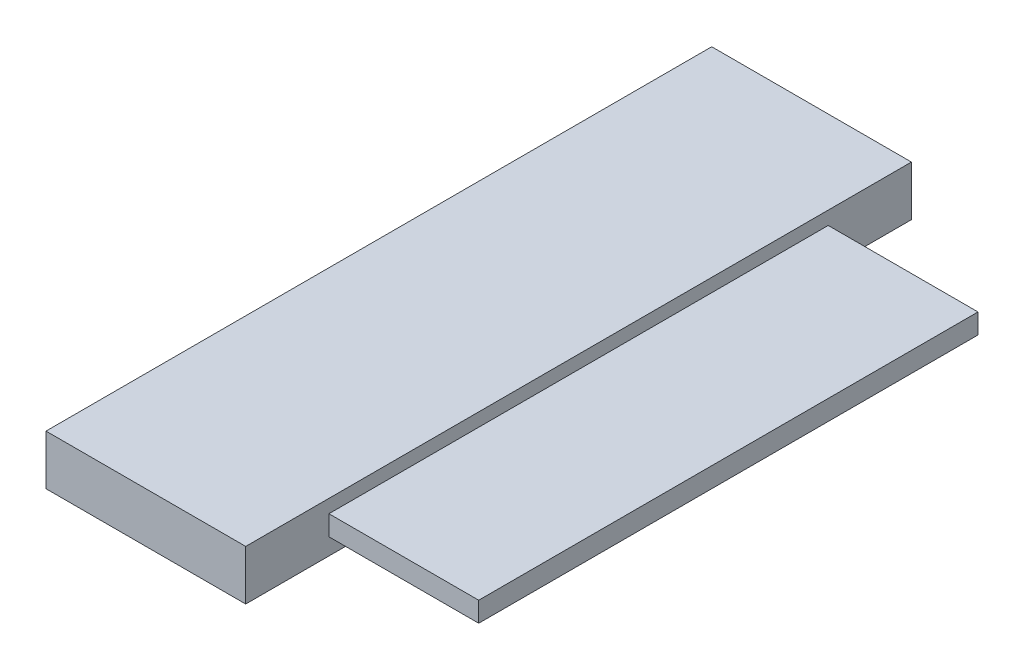
ISO-10303-21;
HEADER;
FILE_DESCRIPTION(('STEP AP214'),'2;1');
FILE_NAME('part.step','',(''),(''),'','','');
FILE_SCHEMA(('AUTOMOTIVE_DESIGN { 1 0 10303 214 1 1 1 1 }'));
ENDSEC;
DATA;
#1=APPLICATION_CONTEXT('core data for automotive mechanical design processes');
#2=APPLICATION_PROTOCOL_DEFINITION('international standard','automotive_design',2000,#1);
#3=PRODUCT_CONTEXT('',#1,'mechanical');
#4=PRODUCT('Part','Part','',(#3));
#5=PRODUCT_RELATED_PRODUCT_CATEGORY('part','',(#4));
#6=PRODUCT_DEFINITION_FORMATION('','',#4);
#7=PRODUCT_DEFINITION_CONTEXT('part definition',#1,'design');
#8=PRODUCT_DEFINITION('design','',#6,#7);
#9=PRODUCT_DEFINITION_SHAPE('','',#8);
#10=(LENGTH_UNIT() NAMED_UNIT(*) SI_UNIT(.MILLI.,.METRE.));
#11=(NAMED_UNIT(*) PLANE_ANGLE_UNIT() SI_UNIT($,.RADIAN.));
#12=(NAMED_UNIT(*) SI_UNIT($,.STERADIAN.) SOLID_ANGLE_UNIT());
#13=UNCERTAINTY_MEASURE_WITH_UNIT(LENGTH_MEASURE(1.E-05),#10,'distance_accuracy_value','');
#14=(GEOMETRIC_REPRESENTATION_CONTEXT(3) GLOBAL_UNCERTAINTY_ASSIGNED_CONTEXT((#13)) GLOBAL_UNIT_ASSIGNED_CONTEXT((#10,
#11,#12)) REPRESENTATION_CONTEXT('',''));
#15=CARTESIAN_POINT('',(0.,0.,0.));
#16=DIRECTION('',(0.,0.,1.));
#17=DIRECTION('',(1.,0.,0.));
#18=AXIS2_PLACEMENT_3D('',#15,#16,#17);
#19=CARTESIAN_POINT('',(0.,3.75,-50.));
#20=DIRECTION('',(-1.,0.,0.));
#21=DIRECTION('',(0.,0.,1.));
#22=AXIS2_PLACEMENT_3D('',#19,#20,#21);
#23=PLANE('',#22);
#24=DIRECTION('',(0.,0.,-1.));
#25=VECTOR('',#24,1.);
#26=CARTESIAN_POINT('',(0.,-3.75,-50.));
#27=LINE('',#26,#25);
#28=CARTESIAN_POINT('',(0.,-3.75,50.));
#29=VERTEX_POINT('',#28);
#30=CARTESIAN_POINT('',(0.,-3.75,-50.));
#31=VERTEX_POINT('',#30);
#32=EDGE_CURVE('E165',#29,#31,#27,.T.);
#33=ORIENTED_EDGE('',*,*,#32,.T.);
#34=DIRECTION('',(0.,-1.,0.));
#35=VECTOR('',#34,1.);
#36=CARTESIAN_POINT('',(0.,3.75,-50.));
#37=LINE('',#36,#35);
#38=CARTESIAN_POINT('',(0.,3.75,-50.));
#39=VERTEX_POINT('',#38);
#40=EDGE_CURVE('E169',#39,#31,#37,.T.);
#41=ORIENTED_EDGE('',*,*,#40,.F.);
#42=DIRECTION('',(0.,0.,-1.));
#43=VECTOR('',#42,1.);
#44=CARTESIAN_POINT('',(0.,3.75,-50.));
#45=LINE('',#44,#43);
#46=CARTESIAN_POINT('',(0.,3.75,50.));
#47=VERTEX_POINT('',#46);
#48=EDGE_CURVE('E157',#47,#39,#45,.T.);
#49=ORIENTED_EDGE('',*,*,#48,.F.);
#50=DIRECTION('',(0.,-1.,0.));
#51=VECTOR('',#50,1.);
#52=CARTESIAN_POINT('',(0.,3.75,50.));
#53=LINE('',#52,#51);
#54=EDGE_CURVE('E49',#47,#29,#53,.T.);
#55=ORIENTED_EDGE('',*,*,#54,.T.);
#56=EDGE_LOOP('',(#33,#41,#49,#55));
#57=FACE_BOUND('',#56,.T.);
#58=DIRECTION('',(0.,0.,1.));
#59=VECTOR('',#58,1.);
#60=CARTESIAN_POINT('',(0.,1.75,-37.5));
#61=LINE('',#60,#59);
#62=CARTESIAN_POINT('',(0.,1.75,-37.5));
#63=VERTEX_POINT('',#62);
#64=CARTESIAN_POINT('',(0.,1.75,37.5));
#65=VERTEX_POINT('',#64);
#66=EDGE_CURVE('E56',#63,#65,#61,.T.);
#67=ORIENTED_EDGE('',*,*,#66,.F.);
#68=DIRECTION('',(0.,1.,0.));
#69=VECTOR('',#68,1.);
#70=CARTESIAN_POINT('',(0.,-1.25,-37.5));
#71=LINE('',#70,#69);
#72=CARTESIAN_POINT('',(0.,-1.25,-37.5));
#73=VERTEX_POINT('',#72);
#74=EDGE_CURVE('E137',#73,#63,#71,.T.);
#75=ORIENTED_EDGE('',*,*,#74,.F.);
#76=DIRECTION('',(0.,0.,1.));
#77=VECTOR('',#76,1.);
#78=CARTESIAN_POINT('',(0.,-1.25,-37.5));
#79=LINE('',#78,#77);
#80=CARTESIAN_POINT('',(0.,-1.25,37.5));
#81=VERTEX_POINT('',#80);
#82=EDGE_CURVE('E131',#73,#81,#79,.T.);
#83=ORIENTED_EDGE('',*,*,#82,.T.);
#84=DIRECTION('',(0.,1.,0.));
#85=VECTOR('',#84,1.);
#86=CARTESIAN_POINT('',(0.,-1.25,37.5));
#87=LINE('',#86,#85);
#88=EDGE_CURVE('E117',#81,#65,#87,.T.);
#89=ORIENTED_EDGE('',*,*,#88,.T.);
#90=EDGE_LOOP('',(#67,#75,#83,#89));
#91=FACE_BOUND('',#90,.T.);
#92=ADVANCED_FACE('F41',(#57,#91),#23,.F.);
#93=CARTESIAN_POINT('',(-30.,3.75,-50.));
#94=DIRECTION('',(1.,0.,0.));
#95=DIRECTION('',(0.,0.,-1.));
#96=AXIS2_PLACEMENT_3D('',#93,#94,#95);
#97=PLANE('',#96);
#98=DIRECTION('',(0.,0.,1.));
#99=VECTOR('',#98,1.);
#100=CARTESIAN_POINT('',(-30.,-3.75,-50.));
#101=LINE('',#100,#99);
#102=CARTESIAN_POINT('',(-30.,-3.75,-50.));
#103=VERTEX_POINT('',#102);
#104=CARTESIAN_POINT('',(-30.,-3.75,50.));
#105=VERTEX_POINT('',#104);
#106=EDGE_CURVE('E150',#103,#105,#101,.T.);
#107=ORIENTED_EDGE('',*,*,#106,.T.);
#108=DIRECTION('',(0.,-1.,0.));
#109=VECTOR('',#108,1.);
#110=CARTESIAN_POINT('',(-30.,3.75,50.));
#111=LINE('',#110,#109);
#112=CARTESIAN_POINT('',(-30.,3.75,50.));
#113=VERTEX_POINT('',#112);
#114=EDGE_CURVE('E11',#113,#105,#111,.T.);
#115=ORIENTED_EDGE('',*,*,#114,.F.);
#116=DIRECTION('',(0.,0.,1.));
#117=VECTOR('',#116,1.);
#118=CARTESIAN_POINT('',(-30.,3.75,-50.));
#119=LINE('',#118,#117);
#120=CARTESIAN_POINT('',(-30.,3.75,-50.));
#121=VERTEX_POINT('',#120);
#122=EDGE_CURVE('E154',#121,#113,#119,.T.);
#123=ORIENTED_EDGE('',*,*,#122,.F.);
#124=DIRECTION('',(0.,-1.,0.));
#125=VECTOR('',#124,1.);
#126=CARTESIAN_POINT('',(-30.,3.75,-50.));
#127=LINE('',#126,#125);
#128=EDGE_CURVE('E160',#121,#103,#127,.T.);
#129=ORIENTED_EDGE('',*,*,#128,.T.);
#130=EDGE_LOOP('',(#107,#115,#123,#129));
#131=FACE_BOUND('',#130,.T.);
#132=ADVANCED_FACE('F43',(#131),#97,.F.);
#133=CARTESIAN_POINT('',(-30.,3.75,50.));
#134=DIRECTION('',(0.,0.,-1.));
#135=DIRECTION('',(-1.,0.,0.));
#136=AXIS2_PLACEMENT_3D('',#133,#134,#135);
#137=PLANE('',#136);
#138=DIRECTION('',(1.,0.,0.));
#139=VECTOR('',#138,1.);
#140=CARTESIAN_POINT('',(-30.,-3.75,50.));
#141=LINE('',#140,#139);
#142=EDGE_CURVE('E163',#105,#29,#141,.T.);
#143=ORIENTED_EDGE('',*,*,#142,.T.);
#144=ORIENTED_EDGE('',*,*,#54,.F.);
#145=DIRECTION('',(1.,0.,0.));
#146=VECTOR('',#145,1.);
#147=CARTESIAN_POINT('',(-30.,3.75,50.));
#148=LINE('',#147,#146);
#149=EDGE_CURVE('E93',#113,#47,#148,.T.);
#150=ORIENTED_EDGE('',*,*,#149,.F.);
#151=ORIENTED_EDGE('',*,*,#114,.T.);
#152=EDGE_LOOP('',(#143,#144,#150,#151));
#153=FACE_BOUND('',#152,.T.);
#154=ADVANCED_FACE('F184',(#153),#137,.F.);
#155=CARTESIAN_POINT('',(-30.,3.75,-50.));
#156=DIRECTION('',(0.,0.,1.));
#157=DIRECTION('',(1.,0.,0.));
#158=AXIS2_PLACEMENT_3D('',#155,#156,#157);
#159=PLANE('',#158);
#160=DIRECTION('',(-1.,0.,0.));
#161=VECTOR('',#160,1.);
#162=CARTESIAN_POINT('',(-30.,-3.75,-50.));
#163=LINE('',#162,#161);
#164=EDGE_CURVE('E86',#31,#103,#163,.T.);
#165=ORIENTED_EDGE('',*,*,#164,.T.);
#166=ORIENTED_EDGE('',*,*,#128,.F.);
#167=DIRECTION('',(-1.,0.,0.));
#168=VECTOR('',#167,1.);
#169=CARTESIAN_POINT('',(-30.,3.75,-50.));
#170=LINE('',#169,#168);
#171=EDGE_CURVE('E65',#39,#121,#170,.T.);
#172=ORIENTED_EDGE('',*,*,#171,.F.);
#173=ORIENTED_EDGE('',*,*,#40,.T.);
#174=EDGE_LOOP('',(#165,#166,#172,#173));
#175=FACE_BOUND('',#174,.T.);
#176=ADVANCED_FACE('F181',(#175),#159,.F.);
#177=CARTESIAN_POINT('',(0.,3.75,0.));
#178=DIRECTION('',(0.,1.,0.));
#179=DIRECTION('',(0.,0.,1.));
#180=AXIS2_PLACEMENT_3D('',#177,#178,#179);
#181=PLANE('',#180);
#182=ORIENTED_EDGE('',*,*,#122,.T.);
#183=ORIENTED_EDGE('',*,*,#149,.T.);
#184=ORIENTED_EDGE('',*,*,#48,.T.);
#185=ORIENTED_EDGE('',*,*,#171,.T.);
#186=EDGE_LOOP('',(#182,#183,#184,#185));
#187=FACE_BOUND('',#186,.T.);
#188=ADVANCED_FACE('F183',(#187),#181,.T.);
#189=CARTESIAN_POINT('',(0.,-3.75,0.));
#190=DIRECTION('',(0.,1.,0.));
#191=DIRECTION('',(0.,0.,1.));
#192=AXIS2_PLACEMENT_3D('',#189,#190,#191);
#193=PLANE('',#192);
#194=ORIENTED_EDGE('',*,*,#106,.F.);
#195=ORIENTED_EDGE('',*,*,#164,.F.);
#196=ORIENTED_EDGE('',*,*,#32,.F.);
#197=ORIENTED_EDGE('',*,*,#142,.F.);
#198=EDGE_LOOP('',(#194,#195,#196,#197));
#199=FACE_BOUND('',#198,.T.);
#200=ADVANCED_FACE('F177',(#199),#193,.F.);
#201=CARTESIAN_POINT('',(0.,-1.25,-37.5));
#202=DIRECTION('',(0.,0.,-1.));
#203=DIRECTION('',(-1.,0.,0.));
#204=AXIS2_PLACEMENT_3D('',#201,#202,#203);
#205=PLANE('',#204);
#206=DIRECTION('',(-1.,0.,0.));
#207=VECTOR('',#206,1.);
#208=CARTESIAN_POINT('',(0.,1.75,-37.5));
#209=LINE('',#208,#207);
#210=CARTESIAN_POINT('',(22.5,1.75,-37.5));
#211=VERTEX_POINT('',#210);
#212=EDGE_CURVE('E138',#211,#63,#209,.T.);
#213=ORIENTED_EDGE('',*,*,#212,.F.);
#214=DIRECTION('',(0.,1.,0.));
#215=VECTOR('',#214,1.);
#216=CARTESIAN_POINT('',(22.5,-1.25,-37.5));
#217=LINE('',#216,#215);
#218=CARTESIAN_POINT('',(22.5,-1.25,-37.5));
#219=VERTEX_POINT('',#218);
#220=EDGE_CURVE('E151',#219,#211,#217,.T.);
#221=ORIENTED_EDGE('',*,*,#220,.F.);
#222=DIRECTION('',(-1.,0.,0.));
#223=VECTOR('',#222,1.);
#224=CARTESIAN_POINT('',(0.,-1.25,-37.5));
#225=LINE('',#224,#223);
#226=EDGE_CURVE('E125',#219,#73,#225,.T.);
#227=ORIENTED_EDGE('',*,*,#226,.T.);
#228=ORIENTED_EDGE('',*,*,#74,.T.);
#229=EDGE_LOOP('',(#213,#221,#227,#228));
#230=FACE_BOUND('',#229,.T.);
#231=ADVANCED_FACE('F221',(#230),#205,.T.);
#232=CARTESIAN_POINT('',(22.5,-1.25,-37.5));
#233=DIRECTION('',(1.,0.,0.));
#234=DIRECTION('',(0.,0.,-1.));
#235=AXIS2_PLACEMENT_3D('',#232,#233,#234);
#236=PLANE('',#235);
#237=DIRECTION('',(0.,0.,-1.));
#238=VECTOR('',#237,1.);
#239=CARTESIAN_POINT('',(22.5,1.75,-37.5));
#240=LINE('',#239,#238);
#241=CARTESIAN_POINT('',(22.5,1.75,37.5));
#242=VERTEX_POINT('',#241);
#243=EDGE_CURVE('E140',#242,#211,#240,.T.);
#244=ORIENTED_EDGE('',*,*,#243,.F.);
#245=DIRECTION('',(0.,1.,0.));
#246=VECTOR('',#245,1.);
#247=CARTESIAN_POINT('',(22.5,-1.25,37.5));
#248=LINE('',#247,#246);
#249=CARTESIAN_POINT('',(22.5,-1.25,37.5));
#250=VERTEX_POINT('',#249);
#251=EDGE_CURVE('E124',#250,#242,#248,.T.);
#252=ORIENTED_EDGE('',*,*,#251,.F.);
#253=DIRECTION('',(0.,0.,-1.));
#254=VECTOR('',#253,1.);
#255=CARTESIAN_POINT('',(22.5,-1.25,-37.5));
#256=LINE('',#255,#254);
#257=EDGE_CURVE('E134',#250,#219,#256,.T.);
#258=ORIENTED_EDGE('',*,*,#257,.T.);
#259=ORIENTED_EDGE('',*,*,#220,.T.);
#260=EDGE_LOOP('',(#244,#252,#258,#259));
#261=FACE_BOUND('',#260,.T.);
#262=ADVANCED_FACE('F234',(#261),#236,.T.);
#263=CARTESIAN_POINT('',(0.,-1.25,37.5));
#264=DIRECTION('',(0.,0.,1.));
#265=DIRECTION('',(1.,0.,0.));
#266=AXIS2_PLACEMENT_3D('',#263,#264,#265);
#267=PLANE('',#266);
#268=DIRECTION('',(1.,0.,0.));
#269=VECTOR('',#268,1.);
#270=CARTESIAN_POINT('',(0.,1.75,37.5));
#271=LINE('',#270,#269);
#272=EDGE_CURVE('E121',#65,#242,#271,.T.);
#273=ORIENTED_EDGE('',*,*,#272,.F.);
#274=ORIENTED_EDGE('',*,*,#88,.F.);
#275=DIRECTION('',(1.,0.,0.));
#276=VECTOR('',#275,1.);
#277=CARTESIAN_POINT('',(0.,-1.25,37.5));
#278=LINE('',#277,#276);
#279=EDGE_CURVE('E120',#81,#250,#278,.T.);
#280=ORIENTED_EDGE('',*,*,#279,.T.);
#281=ORIENTED_EDGE('',*,*,#251,.T.);
#282=EDGE_LOOP('',(#273,#274,#280,#281));
#283=FACE_BOUND('',#282,.T.);
#284=ADVANCED_FACE('F119',(#283),#267,.T.);
#285=CARTESIAN_POINT('',(0.,-1.25,0.));
#286=DIRECTION('',(0.,1.,0.));
#287=DIRECTION('',(0.,0.,1.));
#288=AXIS2_PLACEMENT_3D('',#285,#286,#287);
#289=PLANE('',#288);
#290=ORIENTED_EDGE('',*,*,#82,.F.);
#291=ORIENTED_EDGE('',*,*,#226,.F.);
#292=ORIENTED_EDGE('',*,*,#257,.F.);
#293=ORIENTED_EDGE('',*,*,#279,.F.);
#294=EDGE_LOOP('',(#290,#291,#292,#293));
#295=FACE_BOUND('',#294,.T.);
#296=ADVANCED_FACE('F129',(#295),#289,.F.);
#297=CARTESIAN_POINT('',(0.,1.75,0.));
#298=DIRECTION('',(0.,1.,0.));
#299=DIRECTION('',(0.,0.,1.));
#300=AXIS2_PLACEMENT_3D('',#297,#298,#299);
#301=PLANE('',#300);
#302=ORIENTED_EDGE('',*,*,#66,.T.);
#303=ORIENTED_EDGE('',*,*,#272,.T.);
#304=ORIENTED_EDGE('',*,*,#243,.T.);
#305=ORIENTED_EDGE('',*,*,#212,.T.);
#306=EDGE_LOOP('',(#302,#303,#304,#305));
#307=FACE_BOUND('',#306,.T.);
#308=ADVANCED_FACE('F261',(#307),#301,.T.);
#309=CLOSED_SHELL('',(#92,#132,#154,#176,#188,#200,#231,#262,#284,#296,#308));
#310=MANIFOLD_SOLID_BREP('B2',#309);
#311=ADVANCED_BREP_SHAPE_REPRESENTATION('',(#18,#310),#14);
#312=SHAPE_DEFINITION_REPRESENTATION(#9,#311);
ENDSEC;
END-ISO-10303-21;
